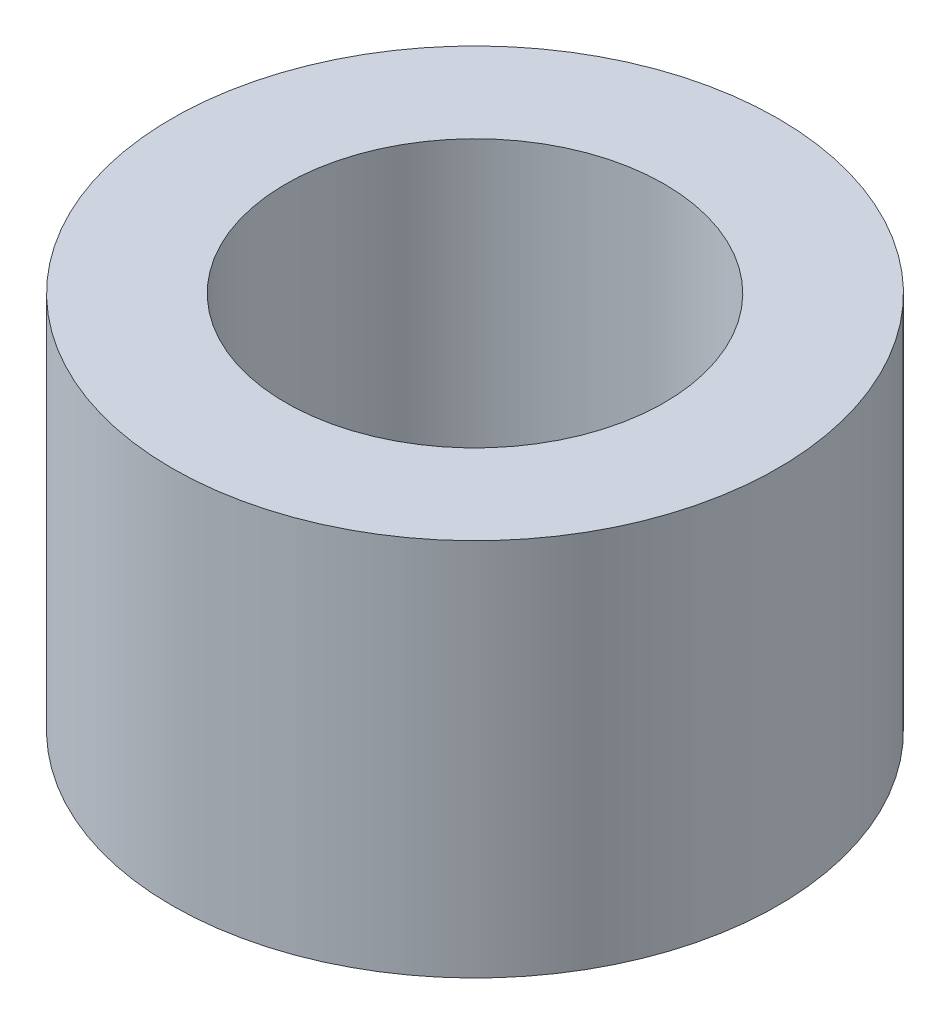
ISO-10303-21;
HEADER;
FILE_DESCRIPTION(('STEP AP214'),'2;1');
FILE_NAME('part.step','',(''),(''),'','','');
FILE_SCHEMA(('AUTOMOTIVE_DESIGN { 1 0 10303 214 1 1 1 1 }'));
ENDSEC;
DATA;
#1=APPLICATION_CONTEXT('core data for automotive mechanical design processes');
#2=APPLICATION_PROTOCOL_DEFINITION('international standard','automotive_design',2000,#1);
#3=PRODUCT_CONTEXT('',#1,'mechanical');
#4=PRODUCT('Part','Part','',(#3));
#5=PRODUCT_RELATED_PRODUCT_CATEGORY('part','',(#4));
#6=PRODUCT_DEFINITION_FORMATION('','',#4);
#7=PRODUCT_DEFINITION_CONTEXT('part definition',#1,'design');
#8=PRODUCT_DEFINITION('design','',#6,#7);
#9=PRODUCT_DEFINITION_SHAPE('','',#8);
#10=(LENGTH_UNIT() NAMED_UNIT(*) SI_UNIT(.MILLI.,.METRE.));
#11=(NAMED_UNIT(*) PLANE_ANGLE_UNIT() SI_UNIT($,.RADIAN.));
#12=(NAMED_UNIT(*) SI_UNIT($,.STERADIAN.) SOLID_ANGLE_UNIT());
#13=UNCERTAINTY_MEASURE_WITH_UNIT(LENGTH_MEASURE(1.E-05),#10,'distance_accuracy_value','');
#14=(GEOMETRIC_REPRESENTATION_CONTEXT(3) GLOBAL_UNCERTAINTY_ASSIGNED_CONTEXT((#13)) GLOBAL_UNIT_ASSIGNED_CONTEXT((#10,
#11,#12)) REPRESENTATION_CONTEXT('',''));
#15=CARTESIAN_POINT('',(0.,0.,0.));
#16=DIRECTION('',(0.,0.,1.));
#17=DIRECTION('',(1.,0.,0.));
#18=AXIS2_PLACEMENT_3D('',#15,#16,#17);
#19=CARTESIAN_POINT('',(0.,4.7625,0.));
#20=DIRECTION('',(0.,1.,0.));
#21=DIRECTION('',(0.,0.,1.));
#22=AXIS2_PLACEMENT_3D('',#19,#20,#21);
#23=PLANE('',#22);
#24=CARTESIAN_POINT('',(0.,4.7625,0.));
#25=DIRECTION('',(0.,1.,0.));
#26=DIRECTION('',(0.,0.,1.));
#27=AXIS2_PLACEMENT_3D('',#24,#25,#26);
#28=CIRCLE('',#27,3.81);
#29=CARTESIAN_POINT('',(0.,4.7625,-3.81));
#30=VERTEX_POINT('',#29);
#31=EDGE_CURVE('E10',#30,#30,#28,.T.);
#32=ORIENTED_EDGE('',*,*,#31,.T.);
#33=EDGE_LOOP('',(#32));
#34=FACE_BOUND('',#33,.T.);
#35=CARTESIAN_POINT('',(0.,4.7625,0.));
#36=DIRECTION('',(0.,1.,0.));
#37=DIRECTION('',(0.,0.,1.));
#38=AXIS2_PLACEMENT_3D('',#35,#36,#37);
#39=CIRCLE('',#38,2.38125);
#40=CARTESIAN_POINT('',(0.,4.7625,-2.38125));
#41=VERTEX_POINT('',#40);
#42=EDGE_CURVE('E42',#41,#41,#39,.T.);
#43=ORIENTED_EDGE('',*,*,#42,.F.);
#44=EDGE_LOOP('',(#43));
#45=FACE_BOUND('',#44,.T.);
#46=ADVANCED_FACE('F31',(#34,#45),#23,.T.);
#47=CARTESIAN_POINT('',(0.,0.,0.));
#48=DIRECTION('',(0.,1.,0.));
#49=DIRECTION('',(0.,0.,1.));
#50=AXIS2_PLACEMENT_3D('',#47,#48,#49);
#51=PLANE('',#50);
#52=CARTESIAN_POINT('',(0.,0.,0.));
#53=DIRECTION('',(0.,1.,0.));
#54=DIRECTION('',(0.,0.,1.));
#55=AXIS2_PLACEMENT_3D('',#52,#53,#54);
#56=CIRCLE('',#55,3.81);
#57=CARTESIAN_POINT('',(0.,0.,-3.81));
#58=VERTEX_POINT('',#57);
#59=EDGE_CURVE('E35',#58,#58,#56,.T.);
#60=ORIENTED_EDGE('',*,*,#59,.F.);
#61=EDGE_LOOP('',(#60));
#62=FACE_BOUND('',#61,.T.);
#63=CARTESIAN_POINT('',(0.,0.,0.));
#64=DIRECTION('',(0.,1.,0.));
#65=DIRECTION('',(0.,0.,1.));
#66=AXIS2_PLACEMENT_3D('',#63,#64,#65);
#67=CIRCLE('',#66,2.38125);
#68=CARTESIAN_POINT('',(0.,0.,-2.38125));
#69=VERTEX_POINT('',#68);
#70=EDGE_CURVE('E44',#69,#69,#67,.T.);
#71=ORIENTED_EDGE('',*,*,#70,.T.);
#72=EDGE_LOOP('',(#71));
#73=FACE_BOUND('',#72,.T.);
#74=ADVANCED_FACE('F54',(#62,#73),#51,.F.);
#75=CARTESIAN_POINT('',(0.,4.7625,0.));
#76=DIRECTION('',(0.,-1.,0.));
#77=DIRECTION('',(0.,0.,-1.));
#78=AXIS2_PLACEMENT_3D('',#75,#76,#77);
#79=CYLINDRICAL_SURFACE('',#78,3.81);
#80=CARTESIAN_POINT('',(0.,4.7625,-3.81));
#81=CARTESIAN_POINT('',(0.,4.712890625,-3.81));
#82=CARTESIAN_POINT('',(0.,4.66328125,-3.81));
#83=CARTESIAN_POINT('',(0.,4.5640625,-3.81));
#84=CARTESIAN_POINT('',(0.,4.514453125,-3.81));
#85=CARTESIAN_POINT('',(0.,4.415234375,-3.81));
#86=CARTESIAN_POINT('',(0.,4.365625,-3.81));
#87=CARTESIAN_POINT('',(0.,4.26640625,-3.81));
#88=CARTESIAN_POINT('',(0.,4.216796875,-3.81));
#89=CARTESIAN_POINT('',(0.,4.117578125,-3.81));
#90=CARTESIAN_POINT('',(0.,4.06796875,-3.81));
#91=CARTESIAN_POINT('',(0.,3.96875,-3.81));
#92=CARTESIAN_POINT('',(0.,3.919140625,-3.81));
#93=CARTESIAN_POINT('',(0.,3.819921875,-3.81));
#94=CARTESIAN_POINT('',(0.,3.7703125,-3.81));
#95=CARTESIAN_POINT('',(0.,3.67109375,-3.81));
#96=CARTESIAN_POINT('',(0.,3.621484375,-3.81));
#97=CARTESIAN_POINT('',(0.,3.522265625,-3.81));
#98=CARTESIAN_POINT('',(0.,3.47265625,-3.81));
#99=CARTESIAN_POINT('',(0.,3.3734375,-3.81));
#100=CARTESIAN_POINT('',(0.,3.323828125,-3.81));
#101=CARTESIAN_POINT('',(0.,3.224609375,-3.81));
#102=CARTESIAN_POINT('',(0.,3.175,-3.81));
#103=CARTESIAN_POINT('',(0.,3.07578125,-3.81));
#104=CARTESIAN_POINT('',(0.,3.026171875,-3.81));
#105=CARTESIAN_POINT('',(0.,2.926953125,-3.81));
#106=CARTESIAN_POINT('',(0.,2.87734375,-3.81));
#107=CARTESIAN_POINT('',(0.,2.778125,-3.81));
#108=CARTESIAN_POINT('',(0.,2.728515625,-3.81));
#109=CARTESIAN_POINT('',(0.,2.629296875,-3.81));
#110=CARTESIAN_POINT('',(0.,2.5796875,-3.81));
#111=CARTESIAN_POINT('',(0.,2.48046875,-3.81));
#112=CARTESIAN_POINT('',(0.,2.430859375,-3.81));
#113=CARTESIAN_POINT('',(0.,2.331640625,-3.81));
#114=CARTESIAN_POINT('',(0.,2.28203125,-3.81));
#115=CARTESIAN_POINT('',(0.,2.1828125,-3.81));
#116=CARTESIAN_POINT('',(0.,2.133203125,-3.81));
#117=CARTESIAN_POINT('',(0.,2.033984375,-3.81));
#118=CARTESIAN_POINT('',(0.,1.984375,-3.81));
#119=CARTESIAN_POINT('',(0.,1.88515625,-3.81));
#120=CARTESIAN_POINT('',(0.,1.835546875,-3.81));
#121=CARTESIAN_POINT('',(0.,1.736328125,-3.81));
#122=CARTESIAN_POINT('',(0.,1.68671875,-3.81));
#123=CARTESIAN_POINT('',(0.,1.5875,-3.81));
#124=CARTESIAN_POINT('',(0.,1.537890625,-3.81));
#125=CARTESIAN_POINT('',(0.,1.438671875,-3.81));
#126=CARTESIAN_POINT('',(0.,1.3890625,-3.81));
#127=CARTESIAN_POINT('',(0.,1.28984375,-3.81));
#128=CARTESIAN_POINT('',(0.,1.240234375,-3.81));
#129=CARTESIAN_POINT('',(0.,1.141015625,-3.81));
#130=CARTESIAN_POINT('',(0.,1.09140625,-3.81));
#131=CARTESIAN_POINT('',(0.,0.992187499999999,-3.81));
#132=CARTESIAN_POINT('',(0.,0.942578124999999,-3.81));
#133=CARTESIAN_POINT('',(0.,0.843359375,-3.81));
#134=CARTESIAN_POINT('',(0.,0.79375,-3.81));
#135=CARTESIAN_POINT('',(0.,0.69453125,-3.81));
#136=CARTESIAN_POINT('',(0.,0.644921875,-3.81));
#137=CARTESIAN_POINT('',(0.,0.545703125,-3.81));
#138=CARTESIAN_POINT('',(0.,0.49609375,-3.81));
#139=CARTESIAN_POINT('',(0.,0.396875,-3.81));
#140=CARTESIAN_POINT('',(0.,0.347265625,-3.81));
#141=CARTESIAN_POINT('',(0.,0.248046875,-3.81));
#142=CARTESIAN_POINT('',(0.,0.1984375,-3.81));
#143=CARTESIAN_POINT('',(0.,0.09921875,-3.81));
#144=CARTESIAN_POINT('',(0.,0.049609375,-3.81));
#145=CARTESIAN_POINT('',(0.,0.,-3.81));
#146=B_SPLINE_CURVE_WITH_KNOTS('',3,(#80,#81,#82,#83,#84,#85,#86,#87,#88,#89,#90,#91,#92,#93,
#94,#95,#96,#97,#98,#99,#100,#101,#102,#103,#104,#105,#106,#107,#108,#109,#110,#111,#112,#113,
#114,#115,#116,#117,#118,#119,#120,#121,#122,#123,#124,#125,#126,#127,#128,#129,#130,#131,#132,
#133,#134,#135,#136,#137,#138,#139,#140,#141,#142,#143,#144,#145),.UNSPECIFIED.,.F.,.F.,(4,2,2,
2,2,2,2,2,2,2,2,2,2,2,2,2,2,2,2,2,2,2,2,2,2,2,2,2,2,2,2,2,4),(0.,0.148828125,0.29765625,
0.446484375,0.5953125,0.744140625,0.892968750000001,1.041796875,1.190625,1.339453125,1.48828125,
1.637109375,1.7859375,1.934765625,2.08359375,2.232421875,2.38125,2.530078125,2.67890625,
2.827734375,2.9765625,3.125390625,3.27421875,3.423046875,3.571875,3.720703125,3.86953125,
4.018359375,4.1671875,4.316015625,4.46484375,4.613671875,4.7625),.UNSPECIFIED.);
#147=EDGE_CURVE('BSEAM33',#30,#58,#146,.T.);
#148=ORIENTED_EDGE('',*,*,#31,.F.);
#149=ORIENTED_EDGE('',*,*,#59,.T.);
#150=ORIENTED_EDGE('',*,*,#147,.T.);
#151=ORIENTED_EDGE('',*,*,#147,.F.);
#152=EDGE_LOOP('',(#148,#150,#149,#151));
#153=FACE_BOUND('',#152,.T.);
#154=ADVANCED_FACE('F33',(#153),#79,.T.);
#155=CARTESIAN_POINT('',(0.,4.7625,0.));
#156=DIRECTION('',(0.,-1.,0.));
#157=DIRECTION('',(0.,0.,-1.));
#158=AXIS2_PLACEMENT_3D('',#155,#156,#157);
#159=CYLINDRICAL_SURFACE('',#158,2.38125);
#160=CARTESIAN_POINT('',(0.,4.7625,-2.38125));
#161=CARTESIAN_POINT('',(0.,4.712890625,-2.38125));
#162=CARTESIAN_POINT('',(0.,4.66328125,-2.38125));
#163=CARTESIAN_POINT('',(0.,4.5640625,-2.38125));
#164=CARTESIAN_POINT('',(0.,4.514453125,-2.38125));
#165=CARTESIAN_POINT('',(0.,4.415234375,-2.38125));
#166=CARTESIAN_POINT('',(0.,4.365625,-2.38125));
#167=CARTESIAN_POINT('',(0.,4.26640625,-2.38125));
#168=CARTESIAN_POINT('',(0.,4.216796875,-2.38125));
#169=CARTESIAN_POINT('',(0.,4.117578125,-2.38125));
#170=CARTESIAN_POINT('',(0.,4.06796875,-2.38125));
#171=CARTESIAN_POINT('',(0.,3.96875,-2.38125));
#172=CARTESIAN_POINT('',(0.,3.919140625,-2.38125));
#173=CARTESIAN_POINT('',(0.,3.819921875,-2.38125));
#174=CARTESIAN_POINT('',(0.,3.7703125,-2.38125));
#175=CARTESIAN_POINT('',(0.,3.67109375,-2.38125));
#176=CARTESIAN_POINT('',(0.,3.621484375,-2.38125));
#177=CARTESIAN_POINT('',(0.,3.522265625,-2.38125));
#178=CARTESIAN_POINT('',(0.,3.47265625,-2.38125));
#179=CARTESIAN_POINT('',(0.,3.3734375,-2.38125));
#180=CARTESIAN_POINT('',(0.,3.323828125,-2.38125));
#181=CARTESIAN_POINT('',(0.,3.224609375,-2.38125));
#182=CARTESIAN_POINT('',(0.,3.175,-2.38125));
#183=CARTESIAN_POINT('',(0.,3.07578125,-2.38125));
#184=CARTESIAN_POINT('',(0.,3.026171875,-2.38125));
#185=CARTESIAN_POINT('',(0.,2.926953125,-2.38125));
#186=CARTESIAN_POINT('',(0.,2.87734375,-2.38125));
#187=CARTESIAN_POINT('',(0.,2.778125,-2.38125));
#188=CARTESIAN_POINT('',(0.,2.728515625,-2.38125));
#189=CARTESIAN_POINT('',(0.,2.629296875,-2.38125));
#190=CARTESIAN_POINT('',(0.,2.5796875,-2.38125));
#191=CARTESIAN_POINT('',(0.,2.48046875,-2.38125));
#192=CARTESIAN_POINT('',(0.,2.430859375,-2.38125));
#193=CARTESIAN_POINT('',(0.,2.331640625,-2.38125));
#194=CARTESIAN_POINT('',(0.,2.28203125,-2.38125));
#195=CARTESIAN_POINT('',(0.,2.1828125,-2.38125));
#196=CARTESIAN_POINT('',(0.,2.133203125,-2.38125));
#197=CARTESIAN_POINT('',(0.,2.033984375,-2.38125));
#198=CARTESIAN_POINT('',(0.,1.984375,-2.38125));
#199=CARTESIAN_POINT('',(0.,1.88515625,-2.38125));
#200=CARTESIAN_POINT('',(0.,1.835546875,-2.38125));
#201=CARTESIAN_POINT('',(0.,1.736328125,-2.38125));
#202=CARTESIAN_POINT('',(0.,1.68671875,-2.38125));
#203=CARTESIAN_POINT('',(0.,1.5875,-2.38125));
#204=CARTESIAN_POINT('',(0.,1.537890625,-2.38125));
#205=CARTESIAN_POINT('',(0.,1.438671875,-2.38125));
#206=CARTESIAN_POINT('',(0.,1.3890625,-2.38125));
#207=CARTESIAN_POINT('',(0.,1.28984375,-2.38125));
#208=CARTESIAN_POINT('',(0.,1.240234375,-2.38125));
#209=CARTESIAN_POINT('',(0.,1.141015625,-2.38125));
#210=CARTESIAN_POINT('',(0.,1.09140625,-2.38125));
#211=CARTESIAN_POINT('',(0.,0.992187499999999,-2.38125));
#212=CARTESIAN_POINT('',(0.,0.942578124999999,-2.38125));
#213=CARTESIAN_POINT('',(0.,0.843359375,-2.38125));
#214=CARTESIAN_POINT('',(0.,0.79375,-2.38125));
#215=CARTESIAN_POINT('',(0.,0.69453125,-2.38125));
#216=CARTESIAN_POINT('',(0.,0.644921875,-2.38125));
#217=CARTESIAN_POINT('',(0.,0.545703125,-2.38125));
#218=CARTESIAN_POINT('',(0.,0.49609375,-2.38125));
#219=CARTESIAN_POINT('',(0.,0.396875,-2.38125));
#220=CARTESIAN_POINT('',(0.,0.347265625,-2.38125));
#221=CARTESIAN_POINT('',(0.,0.248046875,-2.38125));
#222=CARTESIAN_POINT('',(0.,0.1984375,-2.38125));
#223=CARTESIAN_POINT('',(0.,0.09921875,-2.38125));
#224=CARTESIAN_POINT('',(0.,0.049609375,-2.38125));
#225=CARTESIAN_POINT('',(0.,0.,-2.38125));
#226=B_SPLINE_CURVE_WITH_KNOTS('',3,(#160,#161,#162,#163,#164,#165,#166,#167,#168,#169,#170,
#171,#172,#173,#174,#175,#176,#177,#178,#179,#180,#181,#182,#183,#184,#185,#186,#187,#188,#189,
#190,#191,#192,#193,#194,#195,#196,#197,#198,#199,#200,#201,#202,#203,#204,#205,#206,#207,#208,
#209,#210,#211,#212,#213,#214,#215,#216,#217,#218,#219,#220,#221,#222,#223,#224,#225),
.UNSPECIFIED.,.F.,.F.,(4,2,2,2,2,2,2,2,2,2,2,2,2,2,2,2,2,2,2,2,2,2,2,2,2,2,2,2,2,2,2,2,4),(0.,
0.148828125,0.29765625,0.446484375,0.5953125,0.744140625,0.892968750000001,1.041796875,1.190625,
1.339453125,1.48828125,1.637109375,1.7859375,1.934765625,2.08359375,2.232421875,2.38125,
2.530078125,2.67890625,2.827734375,2.9765625,3.125390625,3.27421875,3.423046875,3.571875,
3.720703125,3.86953125,4.018359375,4.1671875,4.316015625,4.46484375,4.613671875,4.7625),.UNSPECIFIED.);
#227=EDGE_CURVE('BSEAM50',#41,#69,#226,.T.);
#228=ORIENTED_EDGE('',*,*,#42,.T.);
#229=ORIENTED_EDGE('',*,*,#70,.F.);
#230=ORIENTED_EDGE('',*,*,#227,.T.);
#231=ORIENTED_EDGE('',*,*,#227,.F.);
#232=EDGE_LOOP('',(#228,#230,#229,#231));
#233=FACE_BOUND('',#232,.T.);
#234=ADVANCED_FACE('F50',(#233),#159,.F.);
#235=CLOSED_SHELL('',(#46,#74,#154,#234));
#236=MANIFOLD_SOLID_BREP('B2',#235);
#237=ADVANCED_BREP_SHAPE_REPRESENTATION('',(#18,#236),#14);
#238=SHAPE_DEFINITION_REPRESENTATION(#9,#237);
ENDSEC;
END-ISO-10303-21;
